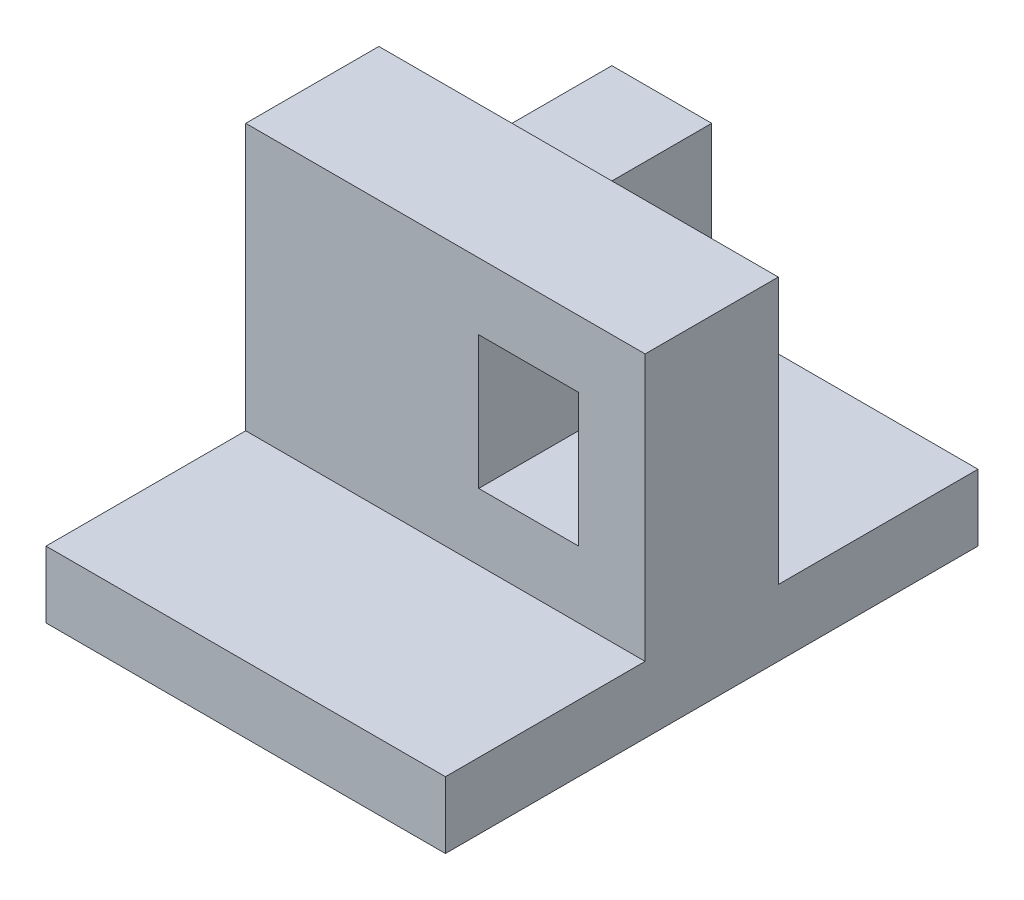
ISO-10303-21;
HEADER;
FILE_DESCRIPTION(('STEP AP214'),'2;1');
FILE_NAME('part.step','',(''),(''),'','','');
FILE_SCHEMA(('AUTOMOTIVE_DESIGN { 1 0 10303 214 1 1 1 1 }'));
ENDSEC;
DATA;
#1=APPLICATION_CONTEXT('core data for automotive mechanical design processes');
#2=APPLICATION_PROTOCOL_DEFINITION('international standard','automotive_design',2000,#1);
#3=PRODUCT_CONTEXT('',#1,'mechanical');
#4=PRODUCT('Part','Part','',(#3));
#5=PRODUCT_RELATED_PRODUCT_CATEGORY('part','',(#4));
#6=PRODUCT_DEFINITION_FORMATION('','',#4);
#7=PRODUCT_DEFINITION_CONTEXT('part definition',#1,'design');
#8=PRODUCT_DEFINITION('design','',#6,#7);
#9=PRODUCT_DEFINITION_SHAPE('','',#8);
#10=(LENGTH_UNIT() NAMED_UNIT(*) SI_UNIT(.MILLI.,.METRE.));
#11=(NAMED_UNIT(*) PLANE_ANGLE_UNIT() SI_UNIT($,.RADIAN.));
#12=(NAMED_UNIT(*) SI_UNIT($,.STERADIAN.) SOLID_ANGLE_UNIT());
#13=UNCERTAINTY_MEASURE_WITH_UNIT(LENGTH_MEASURE(1.E-05),#10,'distance_accuracy_value','');
#14=(GEOMETRIC_REPRESENTATION_CONTEXT(3) GLOBAL_UNCERTAINTY_ASSIGNED_CONTEXT((#13)) GLOBAL_UNIT_ASSIGNED_CONTEXT((#10,
#11,#12)) REPRESENTATION_CONTEXT('',''));
#15=CARTESIAN_POINT('',(0.,0.,0.));
#16=DIRECTION('',(0.,0.,1.));
#17=DIRECTION('',(1.,0.,0.));
#18=AXIS2_PLACEMENT_3D('',#15,#16,#17);
#19=CARTESIAN_POINT('',(-60.,9.99999999999999,80.));
#20=DIRECTION('',(0.,-1.,0.));
#21=DIRECTION('',(0.,0.,-1.));
#22=AXIS2_PLACEMENT_3D('',#19,#20,#21);
#23=PLANE('',#22);
#24=DIRECTION('',(-1.,0.,0.));
#25=VECTOR('',#24,1.);
#26=CARTESIAN_POINT('',(0.,9.99999999999999,30.));
#27=LINE('',#26,#25);
#28=CARTESIAN_POINT('',(0.,9.99999999999999,30.));
#29=VERTEX_POINT('',#28);
#30=CARTESIAN_POINT('',(-60.,9.99999999999999,30.));
#31=VERTEX_POINT('',#30);
#32=EDGE_CURVE('E233',#29,#31,#27,.T.);
#33=ORIENTED_EDGE('',*,*,#32,.F.);
#34=DIRECTION('',(0.,0.,-1.));
#35=VECTOR('',#34,1.);
#36=CARTESIAN_POINT('',(0.,9.99999999999999,80.));
#37=LINE('',#36,#35);
#38=CARTESIAN_POINT('',(0.,9.99999999999999,0.));
#39=VERTEX_POINT('',#38);
#40=EDGE_CURVE('E41',#29,#39,#37,.T.);
#41=ORIENTED_EDGE('',*,*,#40,.T.);
#42=DIRECTION('',(-1.,0.,0.));
#43=VECTOR('',#42,1.);
#44=CARTESIAN_POINT('',(-60.,9.99999999999999,0.));
#45=LINE('',#44,#43);
#46=CARTESIAN_POINT('',(-60.,9.99999999999999,0.));
#47=VERTEX_POINT('',#46);
#48=EDGE_CURVE('E255',#39,#47,#45,.T.);
#49=ORIENTED_EDGE('',*,*,#48,.T.);
#50=DIRECTION('',(0.,0.,-1.));
#51=VECTOR('',#50,1.);
#52=CARTESIAN_POINT('',(-60.,9.99999999999999,80.));
#53=LINE('',#52,#51);
#54=EDGE_CURVE('E265',#31,#47,#53,.T.);
#55=ORIENTED_EDGE('',*,*,#54,.F.);
#56=EDGE_LOOP('',(#33,#41,#49,#55));
#57=FACE_BOUND('',#56,.T.);
#58=ADVANCED_FACE('F33',(#57),#23,.F.);
#59=CARTESIAN_POINT('',(0.,9.99999999999999,80.));
#60=DIRECTION('',(-1.,0.,0.));
#61=DIRECTION('',(0.,0.,1.));
#62=AXIS2_PLACEMENT_3D('',#59,#60,#61);
#63=PLANE('',#62);
#64=DIRECTION('',(0.,1.,0.));
#65=VECTOR('',#64,1.);
#66=CARTESIAN_POINT('',(0.,9.99999999999999,0.));
#67=LINE('',#66,#65);
#68=CARTESIAN_POINT('',(0.,0.,0.));
#69=VERTEX_POINT('',#68);
#70=EDGE_CURVE('E235',#69,#39,#67,.T.);
#71=ORIENTED_EDGE('',*,*,#70,.T.);
#72=ORIENTED_EDGE('',*,*,#40,.F.);
#73=DIRECTION('',(0.,-1.,0.));
#74=VECTOR('',#73,1.);
#75=CARTESIAN_POINT('',(0.,9.99999999999999,30.));
#76=LINE('',#75,#74);
#77=CARTESIAN_POINT('',(0.,50.,30.));
#78=VERTEX_POINT('',#77);
#79=EDGE_CURVE('E223',#78,#29,#76,.T.);
#80=ORIENTED_EDGE('',*,*,#79,.F.);
#81=DIRECTION('',(0.,0.,-1.));
#82=VECTOR('',#81,1.);
#83=CARTESIAN_POINT('',(0.,50.,30.));
#84=LINE('',#83,#82);
#85=CARTESIAN_POINT('',(0.,50.,50.));
#86=VERTEX_POINT('',#85);
#87=EDGE_CURVE('E219',#86,#78,#84,.T.);
#88=ORIENTED_EDGE('',*,*,#87,.F.);
#89=DIRECTION('',(0.,1.,0.));
#90=VECTOR('',#89,1.);
#91=CARTESIAN_POINT('',(0.,50.,50.));
#92=LINE('',#91,#90);
#93=CARTESIAN_POINT('',(0.,9.99999999999999,50.));
#94=VERTEX_POINT('',#93);
#95=EDGE_CURVE('E216',#94,#86,#92,.T.);
#96=ORIENTED_EDGE('',*,*,#95,.F.);
#97=CARTESIAN_POINT('',(0.,9.99999999999999,80.));
#98=VERTEX_POINT('',#97);
#99=EDGE_CURVE('E11',#98,#94,#37,.T.);
#100=ORIENTED_EDGE('',*,*,#99,.F.);
#101=DIRECTION('',(0.,1.,0.));
#102=VECTOR('',#101,1.);
#103=CARTESIAN_POINT('',(0.,9.99999999999999,80.));
#104=LINE('',#103,#102);
#105=CARTESIAN_POINT('',(0.,0.,80.));
#106=VERTEX_POINT('',#105);
#107=EDGE_CURVE('E242',#106,#98,#104,.T.);
#108=ORIENTED_EDGE('',*,*,#107,.F.);
#109=DIRECTION('',(0.,0.,-1.));
#110=VECTOR('',#109,1.);
#111=CARTESIAN_POINT('',(0.,0.,80.));
#112=LINE('',#111,#110);
#113=EDGE_CURVE('E252',#106,#69,#112,.T.);
#114=ORIENTED_EDGE('',*,*,#113,.T.);
#115=EDGE_LOOP('',(#71,#72,#80,#88,#96,#100,#108,#114));
#116=FACE_BOUND('',#115,.T.);
#117=ADVANCED_FACE('F35',(#116),#63,.F.);
#118=ORIENTED_EDGE('',*,*,#99,.T.);
#119=DIRECTION('',(-1.,0.,0.));
#120=VECTOR('',#119,1.);
#121=CARTESIAN_POINT('',(0.,9.99999999999999,50.));
#122=LINE('',#121,#120);
#123=CARTESIAN_POINT('',(-60.,9.99999999999999,50.));
#124=VERTEX_POINT('',#123);
#125=EDGE_CURVE('E225',#94,#124,#122,.T.);
#126=ORIENTED_EDGE('',*,*,#125,.T.);
#127=CARTESIAN_POINT('',(-60.,9.99999999999999,80.));
#128=VERTEX_POINT('',#127);
#129=EDGE_CURVE('E266',#128,#124,#53,.T.);
#130=ORIENTED_EDGE('',*,*,#129,.F.);
#131=DIRECTION('',(-1.,0.,0.));
#132=VECTOR('',#131,1.);
#133=CARTESIAN_POINT('',(-60.,9.99999999999999,80.));
#134=LINE('',#133,#132);
#135=EDGE_CURVE('E245',#98,#128,#134,.T.);
#136=ORIENTED_EDGE('',*,*,#135,.F.);
#137=EDGE_LOOP('',(#118,#126,#130,#136));
#138=FACE_BOUND('',#137,.T.);
#139=ADVANCED_FACE('F295',(#138),#23,.F.);
#140=CARTESIAN_POINT('',(-60.,0.,80.));
#141=DIRECTION('',(1.,0.,0.));
#142=DIRECTION('',(0.,0.,-1.));
#143=AXIS2_PLACEMENT_3D('',#140,#141,#142);
#144=PLANE('',#143);
#145=DIRECTION('',(0.,-1.,0.));
#146=VECTOR('',#145,1.);
#147=CARTESIAN_POINT('',(-60.,0.,0.));
#148=LINE('',#147,#146);
#149=CARTESIAN_POINT('',(-60.,0.,0.));
#150=VERTEX_POINT('',#149);
#151=EDGE_CURVE('E258',#47,#150,#148,.T.);
#152=ORIENTED_EDGE('',*,*,#151,.T.);
#153=DIRECTION('',(0.,0.,-1.));
#154=VECTOR('',#153,1.);
#155=CARTESIAN_POINT('',(-60.,0.,80.));
#156=LINE('',#155,#154);
#157=CARTESIAN_POINT('',(-60.,0.,80.));
#158=VERTEX_POINT('',#157);
#159=EDGE_CURVE('E263',#158,#150,#156,.T.);
#160=ORIENTED_EDGE('',*,*,#159,.F.);
#161=DIRECTION('',(0.,-1.,0.));
#162=VECTOR('',#161,1.);
#163=CARTESIAN_POINT('',(-60.,0.,80.));
#164=LINE('',#163,#162);
#165=EDGE_CURVE('E248',#128,#158,#164,.T.);
#166=ORIENTED_EDGE('',*,*,#165,.F.);
#167=ORIENTED_EDGE('',*,*,#129,.T.);
#168=DIRECTION('',(0.,1.,0.));
#169=VECTOR('',#168,1.);
#170=CARTESIAN_POINT('',(-60.,50.,50.));
#171=LINE('',#170,#169);
#172=CARTESIAN_POINT('',(-60.,50.,50.));
#173=VERTEX_POINT('',#172);
#174=EDGE_CURVE('E215',#124,#173,#171,.T.);
#175=ORIENTED_EDGE('',*,*,#174,.T.);
#176=DIRECTION('',(0.,0.,-1.));
#177=VECTOR('',#176,1.);
#178=CARTESIAN_POINT('',(-60.,50.,30.));
#179=LINE('',#178,#177);
#180=CARTESIAN_POINT('',(-60.,50.,30.));
#181=VERTEX_POINT('',#180);
#182=EDGE_CURVE('E228',#173,#181,#179,.T.);
#183=ORIENTED_EDGE('',*,*,#182,.T.);
#184=DIRECTION('',(0.,-1.,0.));
#185=VECTOR('',#184,1.);
#186=CARTESIAN_POINT('',(-60.,9.99999999999999,30.));
#187=LINE('',#186,#185);
#188=EDGE_CURVE('E220',#181,#31,#187,.T.);
#189=ORIENTED_EDGE('',*,*,#188,.T.);
#190=ORIENTED_EDGE('',*,*,#54,.T.);
#191=EDGE_LOOP('',(#152,#160,#166,#167,#175,#183,#189,#190));
#192=FACE_BOUND('',#191,.T.);
#193=ADVANCED_FACE('F272',(#192),#144,.F.);
#194=CARTESIAN_POINT('',(0.,0.,80.));
#195=DIRECTION('',(0.,1.,0.));
#196=DIRECTION('',(0.,0.,1.));
#197=AXIS2_PLACEMENT_3D('',#194,#195,#196);
#198=PLANE('',#197);
#199=DIRECTION('',(1.,0.,0.));
#200=VECTOR('',#199,1.);
#201=CARTESIAN_POINT('',(0.,0.,0.));
#202=LINE('',#201,#200);
#203=EDGE_CURVE('E246',#150,#69,#202,.T.);
#204=ORIENTED_EDGE('',*,*,#203,.T.);
#205=ORIENTED_EDGE('',*,*,#113,.F.);
#206=DIRECTION('',(1.,0.,0.));
#207=VECTOR('',#206,1.);
#208=CARTESIAN_POINT('',(0.,0.,80.));
#209=LINE('',#208,#207);
#210=EDGE_CURVE('E250',#158,#106,#209,.T.);
#211=ORIENTED_EDGE('',*,*,#210,.F.);
#212=ORIENTED_EDGE('',*,*,#159,.T.);
#213=EDGE_LOOP('',(#204,#205,#211,#212));
#214=FACE_BOUND('',#213,.T.);
#215=ADVANCED_FACE('F286',(#214),#198,.F.);
#216=CARTESIAN_POINT('',(0.,0.,80.));
#217=DIRECTION('',(0.,0.,-1.));
#218=DIRECTION('',(-1.,0.,0.));
#219=AXIS2_PLACEMENT_3D('',#216,#217,#218);
#220=PLANE('',#219);
#221=ORIENTED_EDGE('',*,*,#107,.T.);
#222=ORIENTED_EDGE('',*,*,#135,.T.);
#223=ORIENTED_EDGE('',*,*,#165,.T.);
#224=ORIENTED_EDGE('',*,*,#210,.T.);
#225=EDGE_LOOP('',(#221,#222,#223,#224));
#226=FACE_BOUND('',#225,.T.);
#227=ADVANCED_FACE('F293',(#226),#220,.F.);
#228=CARTESIAN_POINT('',(0.,0.,0.));
#229=DIRECTION('',(0.,0.,-1.));
#230=DIRECTION('',(-1.,0.,0.));
#231=AXIS2_PLACEMENT_3D('',#228,#229,#230);
#232=PLANE('',#231);
#233=ORIENTED_EDGE('',*,*,#70,.F.);
#234=ORIENTED_EDGE('',*,*,#203,.F.);
#235=ORIENTED_EDGE('',*,*,#151,.F.);
#236=ORIENTED_EDGE('',*,*,#48,.F.);
#237=EDGE_LOOP('',(#233,#234,#235,#236));
#238=FACE_BOUND('',#237,.T.);
#239=ADVANCED_FACE('F283',(#238),#232,.T.);
#240=CARTESIAN_POINT('',(0.,9.99999999999999,30.));
#241=DIRECTION('',(0.,0.,-1.));
#242=DIRECTION('',(0.,1.,0.));
#243=AXIS2_PLACEMENT_3D('',#240,#241,#242);
#244=PLANE('',#243);
#245=DIRECTION('',(1.,0.,0.));
#246=VECTOR('',#245,1.);
#247=CARTESIAN_POINT('',(0.,40.,30.));
#248=LINE('',#247,#246);
#249=CARTESIAN_POINT('',(-25.,40.,30.));
#250=VERTEX_POINT('',#249);
#251=CARTESIAN_POINT('',(-9.99999999999999,40.,30.));
#252=VERTEX_POINT('',#251);
#253=EDGE_CURVE('E213',#250,#252,#248,.T.);
#254=ORIENTED_EDGE('',*,*,#253,.F.);
#255=DIRECTION('',(0.,1.,0.));
#256=VECTOR('',#255,1.);
#257=CARTESIAN_POINT('',(-25.,9.99999999999999,30.));
#258=LINE('',#257,#256);
#259=CARTESIAN_POINT('',(-25.,20.,30.));
#260=VERTEX_POINT('',#259);
#261=EDGE_CURVE('E207',#260,#250,#258,.T.);
#262=ORIENTED_EDGE('',*,*,#261,.F.);
#263=DIRECTION('',(-1.,0.,0.));
#264=VECTOR('',#263,1.);
#265=CARTESIAN_POINT('',(0.,20.,30.));
#266=LINE('',#265,#264);
#267=CARTESIAN_POINT('',(-9.99999999999999,20.,30.));
#268=VERTEX_POINT('',#267);
#269=EDGE_CURVE('E209',#268,#260,#266,.T.);
#270=ORIENTED_EDGE('',*,*,#269,.F.);
#271=DIRECTION('',(0.,-1.,0.));
#272=VECTOR('',#271,1.);
#273=CARTESIAN_POINT('',(-9.99999999999999,9.99999999999999,30.));
#274=LINE('',#273,#272);
#275=EDGE_CURVE('E211',#252,#268,#274,.T.);
#276=ORIENTED_EDGE('',*,*,#275,.F.);
#277=EDGE_LOOP('',(#254,#262,#270,#276));
#278=FACE_BOUND('',#277,.T.);
#279=DIRECTION('',(1.,0.,0.));
#280=VECTOR('',#279,1.);
#281=CARTESIAN_POINT('',(0.,40.,30.));
#282=LINE('',#281,#280);
#283=CARTESIAN_POINT('',(-50.,40.,30.));
#284=VERTEX_POINT('',#283);
#285=CARTESIAN_POINT('',(-35.,40.,30.));
#286=VERTEX_POINT('',#285);
#287=EDGE_CURVE('E204',#284,#286,#282,.T.);
#288=ORIENTED_EDGE('',*,*,#287,.F.);
#289=DIRECTION('',(0.,1.,0.));
#290=VECTOR('',#289,1.);
#291=CARTESIAN_POINT('',(-50.,9.99999999999999,30.));
#292=LINE('',#291,#290);
#293=CARTESIAN_POINT('',(-50.,20.,30.));
#294=VERTEX_POINT('',#293);
#295=EDGE_CURVE('E194',#294,#284,#292,.T.);
#296=ORIENTED_EDGE('',*,*,#295,.F.);
#297=DIRECTION('',(-1.,0.,0.));
#298=VECTOR('',#297,1.);
#299=CARTESIAN_POINT('',(0.,20.,30.));
#300=LINE('',#299,#298);
#301=CARTESIAN_POINT('',(-35.,20.,30.));
#302=VERTEX_POINT('',#301);
#303=EDGE_CURVE('E153',#302,#294,#300,.T.);
#304=ORIENTED_EDGE('',*,*,#303,.F.);
#305=DIRECTION('',(0.,-1.,0.));
#306=VECTOR('',#305,1.);
#307=CARTESIAN_POINT('',(-35.,9.99999999999999,30.));
#308=LINE('',#307,#306);
#309=EDGE_CURVE('E201',#286,#302,#308,.T.);
#310=ORIENTED_EDGE('',*,*,#309,.F.);
#311=EDGE_LOOP('',(#288,#296,#304,#310));
#312=FACE_BOUND('',#311,.T.);
#313=ORIENTED_EDGE('',*,*,#188,.F.);
#314=DIRECTION('',(-1.,0.,0.));
#315=VECTOR('',#314,1.);
#316=CARTESIAN_POINT('',(0.,50.,30.));
#317=LINE('',#316,#315);
#318=EDGE_CURVE('E236',#78,#181,#317,.T.);
#319=ORIENTED_EDGE('',*,*,#318,.F.);
#320=ORIENTED_EDGE('',*,*,#79,.T.);
#321=ORIENTED_EDGE('',*,*,#32,.T.);
#322=EDGE_LOOP('',(#313,#319,#320,#321));
#323=FACE_BOUND('',#322,.T.);
#324=ADVANCED_FACE('F304',(#278,#312,#323),#244,.T.);
#325=CARTESIAN_POINT('',(0.,50.,30.));
#326=DIRECTION('',(0.,1.,0.));
#327=DIRECTION('',(0.,0.,1.));
#328=AXIS2_PLACEMENT_3D('',#325,#326,#327);
#329=PLANE('',#328);
#330=ORIENTED_EDGE('',*,*,#182,.F.);
#331=DIRECTION('',(-1.,0.,0.));
#332=VECTOR('',#331,1.);
#333=CARTESIAN_POINT('',(0.,50.,50.));
#334=LINE('',#333,#332);
#335=EDGE_CURVE('E238',#86,#173,#334,.T.);
#336=ORIENTED_EDGE('',*,*,#335,.F.);
#337=ORIENTED_EDGE('',*,*,#87,.T.);
#338=ORIENTED_EDGE('',*,*,#318,.T.);
#339=EDGE_LOOP('',(#330,#336,#337,#338));
#340=FACE_BOUND('',#339,.T.);
#341=ADVANCED_FACE('F302',(#340),#329,.T.);
#342=CARTESIAN_POINT('',(0.,50.,50.));
#343=DIRECTION('',(0.,0.,1.));
#344=DIRECTION('',(1.,0.,0.));
#345=AXIS2_PLACEMENT_3D('',#342,#343,#344);
#346=PLANE('',#345);
#347=DIRECTION('',(-1.,0.,0.));
#348=VECTOR('',#347,1.);
#349=CARTESIAN_POINT('',(-9.99999999999999,40.,50.));
#350=LINE('',#349,#348);
#351=CARTESIAN_POINT('',(-9.99999999999999,40.,50.));
#352=VERTEX_POINT('',#351);
#353=CARTESIAN_POINT('',(-25.,40.,50.));
#354=VERTEX_POINT('',#353);
#355=EDGE_CURVE('E56',#352,#354,#350,.T.);
#356=ORIENTED_EDGE('',*,*,#355,.F.);
#357=DIRECTION('',(0.,1.,0.));
#358=VECTOR('',#357,1.);
#359=CARTESIAN_POINT('',(-9.99999999999999,20.,50.));
#360=LINE('',#359,#358);
#361=CARTESIAN_POINT('',(-9.99999999999999,20.,50.));
#362=VERTEX_POINT('',#361);
#363=EDGE_CURVE('E188',#362,#352,#360,.T.);
#364=ORIENTED_EDGE('',*,*,#363,.F.);
#365=DIRECTION('',(1.,0.,0.));
#366=VECTOR('',#365,1.);
#367=CARTESIAN_POINT('',(-25.,20.,50.));
#368=LINE('',#367,#366);
#369=CARTESIAN_POINT('',(-25.,20.,50.));
#370=VERTEX_POINT('',#369);
#371=EDGE_CURVE('E185',#370,#362,#368,.T.);
#372=ORIENTED_EDGE('',*,*,#371,.F.);
#373=DIRECTION('',(0.,-1.,0.));
#374=VECTOR('',#373,1.);
#375=CARTESIAN_POINT('',(-25.,40.,50.));
#376=LINE('',#375,#374);
#377=EDGE_CURVE('E183',#354,#370,#376,.T.);
#378=ORIENTED_EDGE('',*,*,#377,.F.);
#379=EDGE_LOOP('',(#356,#364,#372,#378));
#380=FACE_BOUND('',#379,.T.);
#381=ORIENTED_EDGE('',*,*,#174,.F.);
#382=ORIENTED_EDGE('',*,*,#125,.F.);
#383=ORIENTED_EDGE('',*,*,#95,.T.);
#384=ORIENTED_EDGE('',*,*,#335,.T.);
#385=EDGE_LOOP('',(#381,#382,#383,#384));
#386=FACE_BOUND('',#385,.T.);
#387=ADVANCED_FACE('F297',(#380,#386),#346,.T.);
#388=CARTESIAN_POINT('',(-9.99999999999999,40.,-9.99999999999999));
#389=DIRECTION('',(0.,1.,0.));
#390=DIRECTION('',(-1.,0.,0.));
#391=AXIS2_PLACEMENT_3D('',#388,#389,#390);
#392=PLANE('',#391);
#393=ORIENTED_EDGE('',*,*,#253,.T.);
#394=DIRECTION('',(0.,0.,1.));
#395=VECTOR('',#394,1.);
#396=CARTESIAN_POINT('',(-9.99999999999999,40.,-9.99999999999999));
#397=LINE('',#396,#395);
#398=EDGE_CURVE('E192',#252,#352,#397,.T.);
#399=ORIENTED_EDGE('',*,*,#398,.T.);
#400=ORIENTED_EDGE('',*,*,#355,.T.);
#401=DIRECTION('',(0.,0.,1.));
#402=VECTOR('',#401,1.);
#403=CARTESIAN_POINT('',(-25.,40.,-9.99999999999999));
#404=LINE('',#403,#402);
#405=EDGE_CURVE('E191',#250,#354,#404,.T.);
#406=ORIENTED_EDGE('',*,*,#405,.F.);
#407=EDGE_LOOP('',(#393,#399,#400,#406));
#408=FACE_BOUND('',#407,.T.);
#409=ADVANCED_FACE('F334',(#408),#392,.F.);
#410=CARTESIAN_POINT('',(-9.99999999999999,20.,-9.99999999999999));
#411=DIRECTION('',(1.,0.,0.));
#412=DIRECTION('',(0.,0.,-1.));
#413=AXIS2_PLACEMENT_3D('',#410,#411,#412);
#414=PLANE('',#413);
#415=ORIENTED_EDGE('',*,*,#275,.T.);
#416=DIRECTION('',(0.,0.,1.));
#417=VECTOR('',#416,1.);
#418=CARTESIAN_POINT('',(-9.99999999999999,20.,-9.99999999999999));
#419=LINE('',#418,#417);
#420=EDGE_CURVE('E195',#268,#362,#419,.T.);
#421=ORIENTED_EDGE('',*,*,#420,.T.);
#422=ORIENTED_EDGE('',*,*,#363,.T.);
#423=ORIENTED_EDGE('',*,*,#398,.F.);
#424=EDGE_LOOP('',(#415,#421,#422,#423));
#425=FACE_BOUND('',#424,.T.);
#426=ADVANCED_FACE('F339',(#425),#414,.F.);
#427=CARTESIAN_POINT('',(-25.,20.,-9.99999999999999));
#428=DIRECTION('',(0.,-1.,0.));
#429=DIRECTION('',(0.,0.,-1.));
#430=AXIS2_PLACEMENT_3D('',#427,#428,#429);
#431=PLANE('',#430);
#432=ORIENTED_EDGE('',*,*,#269,.T.);
#433=DIRECTION('',(0.,0.,1.));
#434=VECTOR('',#433,1.);
#435=CARTESIAN_POINT('',(-25.,20.,-9.99999999999999));
#436=LINE('',#435,#434);
#437=EDGE_CURVE('E48',#260,#370,#436,.T.);
#438=ORIENTED_EDGE('',*,*,#437,.T.);
#439=ORIENTED_EDGE('',*,*,#371,.T.);
#440=ORIENTED_EDGE('',*,*,#420,.F.);
#441=EDGE_LOOP('',(#432,#438,#439,#440));
#442=FACE_BOUND('',#441,.T.);
#443=ADVANCED_FACE('F351',(#442),#431,.F.);
#444=CARTESIAN_POINT('',(-25.,40.,-9.99999999999999));
#445=DIRECTION('',(-1.,0.,0.));
#446=DIRECTION('',(0.,0.,1.));
#447=AXIS2_PLACEMENT_3D('',#444,#445,#446);
#448=PLANE('',#447);
#449=ORIENTED_EDGE('',*,*,#261,.T.);
#450=ORIENTED_EDGE('',*,*,#405,.T.);
#451=ORIENTED_EDGE('',*,*,#377,.T.);
#452=ORIENTED_EDGE('',*,*,#437,.F.);
#453=EDGE_LOOP('',(#449,#450,#451,#452));
#454=FACE_BOUND('',#453,.T.);
#455=ADVANCED_FACE('F343',(#454),#448,.F.);
#456=CARTESIAN_POINT('',(-50.,20.,5.));
#457=DIRECTION('',(-1.,0.,0.));
#458=DIRECTION('',(0.,0.,1.));
#459=AXIS2_PLACEMENT_3D('',#456,#457,#458);
#460=PLANE('',#459);
#461=DIRECTION('',(0.,0.,1.));
#462=VECTOR('',#461,1.);
#463=CARTESIAN_POINT('',(-50.,20.,5.));
#464=LINE('',#463,#462);
#465=CARTESIAN_POINT('',(-50.,20.,5.));
#466=VERTEX_POINT('',#465);
#467=EDGE_CURVE('E148',#466,#294,#464,.T.);
#468=ORIENTED_EDGE('',*,*,#467,.T.);
#469=ORIENTED_EDGE('',*,*,#295,.T.);
#470=DIRECTION('',(0.,0.,1.));
#471=VECTOR('',#470,1.);
#472=CARTESIAN_POINT('',(-50.,40.,5.));
#473=LINE('',#472,#471);
#474=CARTESIAN_POINT('',(-50.,40.,5.));
#475=VERTEX_POINT('',#474);
#476=EDGE_CURVE('E172',#475,#284,#473,.T.);
#477=ORIENTED_EDGE('',*,*,#476,.F.);
#478=DIRECTION('',(0.,-1.,0.));
#479=VECTOR('',#478,1.);
#480=CARTESIAN_POINT('',(-50.,20.,5.));
#481=LINE('',#480,#479);
#482=EDGE_CURVE('E165',#475,#466,#481,.T.);
#483=ORIENTED_EDGE('',*,*,#482,.T.);
#484=EDGE_LOOP('',(#468,#469,#477,#483));
#485=FACE_BOUND('',#484,.T.);
#486=ADVANCED_FACE('F170',(#485),#460,.T.);
#487=CARTESIAN_POINT('',(-50.,40.,5.));
#488=DIRECTION('',(0.,1.,0.));
#489=DIRECTION('',(0.,0.,1.));
#490=AXIS2_PLACEMENT_3D('',#487,#488,#489);
#491=PLANE('',#490);
#492=ORIENTED_EDGE('',*,*,#476,.T.);
#493=ORIENTED_EDGE('',*,*,#287,.T.);
#494=DIRECTION('',(0.,0.,1.));
#495=VECTOR('',#494,1.);
#496=CARTESIAN_POINT('',(-35.,40.,5.));
#497=LINE('',#496,#495);
#498=CARTESIAN_POINT('',(-35.,40.,5.));
#499=VERTEX_POINT('',#498);
#500=EDGE_CURVE('E178',#499,#286,#497,.T.);
#501=ORIENTED_EDGE('',*,*,#500,.F.);
#502=DIRECTION('',(-1.,0.,0.));
#503=VECTOR('',#502,1.);
#504=CARTESIAN_POINT('',(-50.,40.,5.));
#505=LINE('',#504,#503);
#506=EDGE_CURVE('E158',#499,#475,#505,.T.);
#507=ORIENTED_EDGE('',*,*,#506,.T.);
#508=EDGE_LOOP('',(#492,#493,#501,#507));
#509=FACE_BOUND('',#508,.T.);
#510=ADVANCED_FACE('F363',(#509),#491,.T.);
#511=CARTESIAN_POINT('',(-35.,40.,5.));
#512=DIRECTION('',(1.,0.,0.));
#513=DIRECTION('',(0.,0.,-1.));
#514=AXIS2_PLACEMENT_3D('',#511,#512,#513);
#515=PLANE('',#514);
#516=ORIENTED_EDGE('',*,*,#500,.T.);
#517=ORIENTED_EDGE('',*,*,#309,.T.);
#518=DIRECTION('',(0.,0.,1.));
#519=VECTOR('',#518,1.);
#520=CARTESIAN_POINT('',(-35.,20.,5.));
#521=LINE('',#520,#519);
#522=CARTESIAN_POINT('',(-35.,20.,5.));
#523=VERTEX_POINT('',#522);
#524=EDGE_CURVE('E157',#523,#302,#521,.T.);
#525=ORIENTED_EDGE('',*,*,#524,.F.);
#526=DIRECTION('',(0.,1.,0.));
#527=VECTOR('',#526,1.);
#528=CARTESIAN_POINT('',(-35.,40.,5.));
#529=LINE('',#528,#527);
#530=EDGE_CURVE('E168',#523,#499,#529,.T.);
#531=ORIENTED_EDGE('',*,*,#530,.T.);
#532=EDGE_LOOP('',(#516,#517,#525,#531));
#533=FACE_BOUND('',#532,.T.);
#534=ADVANCED_FACE('F366',(#533),#515,.T.);
#535=CARTESIAN_POINT('',(-35.,20.,5.));
#536=DIRECTION('',(0.,-1.,0.));
#537=DIRECTION('',(1.,0.,0.));
#538=AXIS2_PLACEMENT_3D('',#535,#536,#537);
#539=PLANE('',#538);
#540=ORIENTED_EDGE('',*,*,#524,.T.);
#541=ORIENTED_EDGE('',*,*,#303,.T.);
#542=ORIENTED_EDGE('',*,*,#467,.F.);
#543=DIRECTION('',(1.,0.,0.));
#544=VECTOR('',#543,1.);
#545=CARTESIAN_POINT('',(-35.,20.,5.));
#546=LINE('',#545,#544);
#547=EDGE_CURVE('E152',#466,#523,#546,.T.);
#548=ORIENTED_EDGE('',*,*,#547,.T.);
#549=EDGE_LOOP('',(#540,#541,#542,#548));
#550=FACE_BOUND('',#549,.T.);
#551=ADVANCED_FACE('F151',(#550),#539,.T.);
#552=CARTESIAN_POINT('',(0.,0.,5.));
#553=DIRECTION('',(0.,0.,-1.));
#554=DIRECTION('',(-1.,0.,0.));
#555=AXIS2_PLACEMENT_3D('',#552,#553,#554);
#556=PLANE('',#555);
#557=ORIENTED_EDGE('',*,*,#482,.F.);
#558=ORIENTED_EDGE('',*,*,#506,.F.);
#559=ORIENTED_EDGE('',*,*,#530,.F.);
#560=ORIENTED_EDGE('',*,*,#547,.F.);
#561=EDGE_LOOP('',(#557,#558,#559,#560));
#562=FACE_BOUND('',#561,.T.);
#563=ADVANCED_FACE('F163',(#562),#556,.T.);
#564=CLOSED_SHELL('',(#58,#117,#139,#193,#215,#227,#239,#324,#341,#387,#409,#426,#443,#455,#486,
#510,#534,#551,#563));
#565=MANIFOLD_SOLID_BREP('B2',#564);
#566=ADVANCED_BREP_SHAPE_REPRESENTATION('',(#18,#565),#14);
#567=SHAPE_DEFINITION_REPRESENTATION(#9,#566);
ENDSEC;
END-ISO-10303-21;
